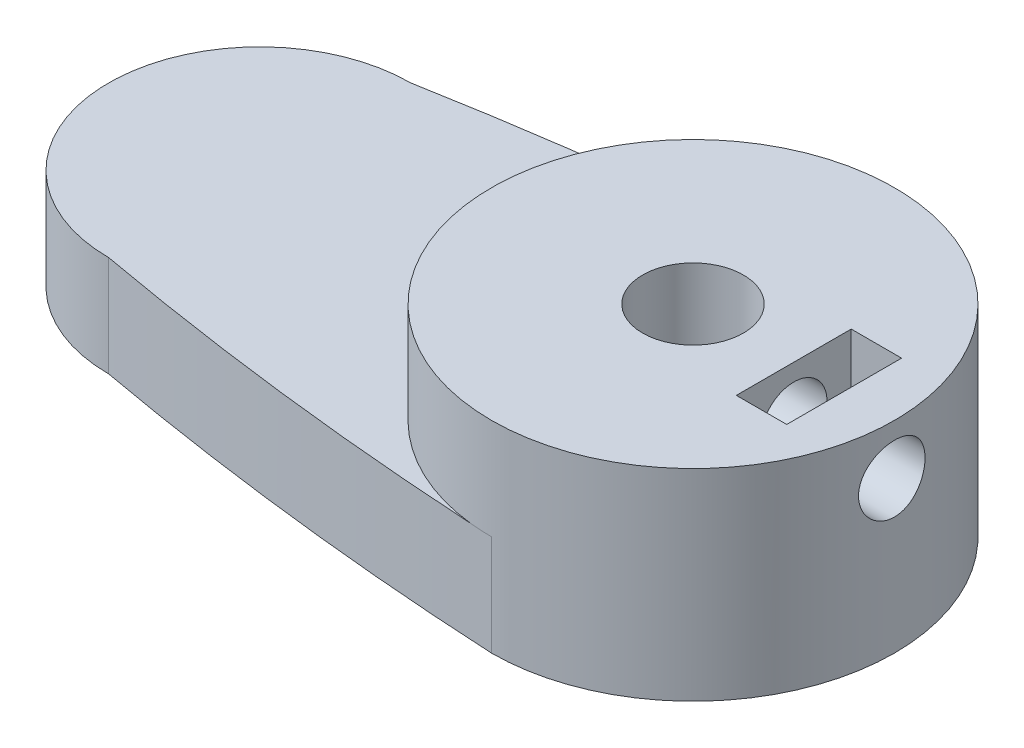
ISO-10303-21;
HEADER;
FILE_DESCRIPTION(('STEP AP214'),'2;1');
FILE_NAME('part.step','',(''),(''),'','','');
FILE_SCHEMA(('AUTOMOTIVE_DESIGN { 1 0 10303 214 1 1 1 1 }'));
ENDSEC;
DATA;
#1=APPLICATION_CONTEXT('core data for automotive mechanical design processes');
#2=APPLICATION_PROTOCOL_DEFINITION('international standard','automotive_design',2000,#1);
#3=PRODUCT_CONTEXT('',#1,'mechanical');
#4=PRODUCT('Part','Part','',(#3));
#5=PRODUCT_RELATED_PRODUCT_CATEGORY('part','',(#4));
#6=PRODUCT_DEFINITION_FORMATION('','',#4);
#7=PRODUCT_DEFINITION_CONTEXT('part definition',#1,'design');
#8=PRODUCT_DEFINITION('design','',#6,#7);
#9=PRODUCT_DEFINITION_SHAPE('','',#8);
#10=(LENGTH_UNIT() NAMED_UNIT(*) SI_UNIT(.MILLI.,.METRE.));
#11=(NAMED_UNIT(*) PLANE_ANGLE_UNIT() SI_UNIT($,.RADIAN.));
#12=(NAMED_UNIT(*) SI_UNIT($,.STERADIAN.) SOLID_ANGLE_UNIT());
#13=UNCERTAINTY_MEASURE_WITH_UNIT(LENGTH_MEASURE(1.E-05),#10,'distance_accuracy_value','');
#14=(GEOMETRIC_REPRESENTATION_CONTEXT(3) GLOBAL_UNCERTAINTY_ASSIGNED_CONTEXT((#13)) GLOBAL_UNIT_ASSIGNED_CONTEXT((#10,
#11,#12)) REPRESENTATION_CONTEXT('',''));
#15=CARTESIAN_POINT('',(0.,0.,0.));
#16=DIRECTION('',(0.,0.,1.));
#17=DIRECTION('',(1.,0.,0.));
#18=AXIS2_PLACEMENT_3D('',#15,#16,#17);
#19=CARTESIAN_POINT('',(0.,5.,0.));
#20=DIRECTION('',(0.,-1.,0.));
#21=DIRECTION('',(0.,0.,-1.));
#22=AXIS2_PLACEMENT_3D('',#19,#20,#21);
#23=CYLINDRICAL_SURFACE('',#22,9.99999999999969);
#24=CARTESIAN_POINT('',(0.,0.,0.));
#25=DIRECTION('',(0.,1.,0.));
#26=DIRECTION('',(0.,0.,1.));
#27=AXIS2_PLACEMENT_3D('',#24,#25,#26);
#28=CIRCLE('',#27,9.99999999999969);
#29=CARTESIAN_POINT('',(-6.46531439496556E-12,0.,9.99999999999969));
#30=VERTEX_POINT('',#29);
#31=CARTESIAN_POINT('',(-6.46574807583456E-12,0.,-9.99999999999969));
#32=VERTEX_POINT('',#31);
#33=EDGE_CURVE('E181',#30,#32,#28,.T.);
#34=ORIENTED_EDGE('',*,*,#33,.T.);
#35=DIRECTION('',(0.,-1.,0.));
#36=VECTOR('',#35,1.);
#37=CARTESIAN_POINT('',(-6.46574807583456E-12,5.,-9.99999999999969));
#38=LINE('',#37,#36);
#39=CARTESIAN_POINT('',(-6.46574807583456E-12,5.,-9.99999999999969));
#40=VERTEX_POINT('',#39);
#41=EDGE_CURVE('E187',#40,#32,#38,.T.);
#42=ORIENTED_EDGE('',*,*,#41,.F.);
#43=CARTESIAN_POINT('',(0.,5.,0.));
#44=DIRECTION('',(0.,1.,0.));
#45=DIRECTION('',(0.,0.,1.));
#46=AXIS2_PLACEMENT_3D('',#43,#44,#45);
#47=CIRCLE('',#46,9.99999999999969);
#48=CARTESIAN_POINT('',(-1.08613173197033,5.,-9.94084090310277));
#49=VERTEX_POINT('',#48);
#50=EDGE_CURVE('E48',#40,#49,#47,.T.);
#51=ORIENTED_EDGE('',*,*,#50,.T.);
#52=CARTESIAN_POINT('',(-1.08613173197033,5.,9.94084090310277));
#53=VERTEX_POINT('',#52);
#54=EDGE_CURVE('E11',#49,#53,#47,.T.);
#55=ORIENTED_EDGE('',*,*,#54,.T.);
#56=CARTESIAN_POINT('',(-6.46531439496556E-12,5.,9.99999999999969));
#57=VERTEX_POINT('',#56);
#58=EDGE_CURVE('E47',#53,#57,#47,.T.);
#59=ORIENTED_EDGE('',*,*,#58,.T.);
#60=DIRECTION('',(0.,-1.,0.));
#61=VECTOR('',#60,1.);
#62=CARTESIAN_POINT('',(-6.46531439496556E-12,5.,9.99999999999969));
#63=LINE('',#62,#61);
#64=EDGE_CURVE('E189',#57,#30,#63,.T.);
#65=ORIENTED_EDGE('',*,*,#64,.T.);
#66=EDGE_LOOP('',(#34,#42,#51,#55,#59,#65));
#67=FACE_BOUND('',#66,.T.);
#68=CARTESIAN_POINT('',(0.,10.,0.));
#69=DIRECTION('',(0.,1.,0.));
#70=DIRECTION('',(0.,0.,1.));
#71=AXIS2_PLACEMENT_3D('',#68,#69,#70);
#72=CIRCLE('',#71,9.99999999999969);
#73=CARTESIAN_POINT('',(0.,10.,9.99999999999969));
#74=VERTEX_POINT('',#73);
#75=EDGE_CURVE('E158',#74,#74,#72,.T.);
#76=ORIENTED_EDGE('',*,*,#75,.F.);
#77=EDGE_LOOP('',(#76));
#78=FACE_BOUND('',#77,.T.);
#79=CARTESIAN_POINT('',(9.86293566845054,7.5,1.65));
#80=CARTESIAN_POINT('',(9.86293731785527,7.40799815763411,1.64999629098035));
#81=CARTESIAN_POINT('',(9.86423691212901,7.31594574295345,1.64227909123111));
#82=CARTESIAN_POINT('',(9.86929026153193,7.13442278665812,1.61162706431046));
#83=CARTESIAN_POINT('',(9.87304629349879,7.04495472085215,1.58867811875357));
#84=CARTESIAN_POINT('',(9.8825757903559,6.87125382338446,1.52827489499291));
#85=CARTESIAN_POINT('',(9.88834758324568,6.78701672082335,1.49083263568619));
#86=CARTESIAN_POINT('',(9.90125628915023,6.62602977552741,1.40253539774319));
#87=CARTESIAN_POINT('',(9.90839304494616,6.54927907203176,1.3516819635744));
#88=CARTESIAN_POINT('',(9.92330460813646,6.40469249754825,1.23748166219591));
#89=CARTESIAN_POINT('',(9.9310843998024,6.33693946492918,1.17403055174128));
#90=CARTESIAN_POINT('',(9.94636114892715,6.21299083427328,1.03666129953611));
#91=CARTESIAN_POINT('',(9.9538580897316,6.15679591591812,0.962742542660854));
#92=CARTESIAN_POINT('',(9.96777711815898,6.05724831658915,0.806000158090804));
#93=CARTESIAN_POINT('',(9.97419266457545,6.01397264811038,0.723126989054621));
#94=CARTESIAN_POINT('',(9.98517060701266,5.94198691122183,0.551164106325252));
#95=CARTESIAN_POINT('',(9.98973312115035,5.91327591439407,0.462074789289345));
#96=CARTESIAN_POINT('',(9.99645574381574,5.87148765336425,0.28106409311301));
#97=CARTESIAN_POINT('',(9.99863722113444,5.85827125081373,0.1891756421165));
#98=CARTESIAN_POINT('',(10.0004253754506,5.84741474747605,0.00446128175041869));
#99=CARTESIAN_POINT('',(10.0000322241299,5.84977360809646,-0.0883645646994442));
#100=CARTESIAN_POINT('',(9.99673235089039,5.86989202770408,-0.27136761803782));
#101=CARTESIAN_POINT('',(9.99385006818927,5.88750185181637,-0.361561789664354));
#102=CARTESIAN_POINT('',(9.98592303427186,5.93738661870974,-0.537697224998586));
#103=CARTESIAN_POINT('',(9.98087821822551,5.96966200114778,-0.6236383611194));
#104=CARTESIAN_POINT('',(9.96915130593351,6.04811098155924,-0.789274301179365));
#105=CARTESIAN_POINT('',(9.96246194992901,6.09434641796588,-0.868939282087194));
#106=CARTESIAN_POINT('',(9.9481893971328,6.19935776294151,-1.01943645906903));
#107=CARTESIAN_POINT('',(9.94060612942516,6.25813466675174,-1.09026795344527));
#108=CARTESIAN_POINT('',(9.9252829108148,6.38739135719332,-1.22197197095425));
#109=CARTESIAN_POINT('',(9.91754216905049,6.45800199873007,-1.28271604906533));
#110=CARTESIAN_POINT('',(9.90286372793586,6.60848050325953,-1.3915146973154));
#111=CARTESIAN_POINT('',(9.8959260357106,6.68834844837508,-1.43956915487058));
#112=CARTESIAN_POINT('',(9.883638864771,6.85522179378199,-1.52164889999091));
#113=CARTESIAN_POINT('',(9.87829111185125,6.94223481993177,-1.55565895856361));
#114=CARTESIAN_POINT('',(9.86981807463738,7.12084660028683,-1.60854450758027));
#115=CARTESIAN_POINT('',(9.86669259878959,7.21244495852144,-1.62742130248435));
#116=CARTESIAN_POINT('',(9.86305497953614,7.39647869507773,-1.64932410589818));
#117=CARTESIAN_POINT('',(9.86251266770366,7.48889171756022,-1.6525331076067));
#118=CARTESIAN_POINT('',(9.86402245062627,7.672934586635,-1.64349666278561));
#119=CARTESIAN_POINT('',(9.86607444725262,7.76456446271754,-1.63125180079262));
#120=CARTESIAN_POINT('',(9.8725137823484,7.94386021319912,-1.59181115051362));
#121=CARTESIAN_POINT('',(9.8768865983285,8.03154709960179,-1.56470830150066));
#122=CARTESIAN_POINT('',(9.88746270071847,8.20113420759304,-1.49641841835946));
#123=CARTESIAN_POINT('',(9.89366609466424,8.28303408887803,-1.45523055679537));
#124=CARTESIAN_POINT('',(9.90727458613165,8.43953738917548,-1.35950711966145));
#125=CARTESIAN_POINT('',(9.9146900482085,8.51406808987048,-1.3048541529275));
#126=CARTESIAN_POINT('',(9.92985673064682,8.65296602506892,-1.183913241756));
#127=CARTESIAN_POINT('',(9.93760797410846,8.71733255890625,-1.11762449587139));
#128=CARTESIAN_POINT('',(9.95266815579972,8.83474209808013,-0.974483484791729));
#129=CARTESIAN_POINT('',(9.95997178743266,8.88766314576579,-0.897530542660932));
#130=CARTESIAN_POINT('',(9.97322896699209,8.97982570565766,-0.735720107735907));
#131=CARTESIAN_POINT('',(9.97918255791241,9.01906765351442,-0.650862866786068));
#132=CARTESIAN_POINT('',(9.98904576356796,9.08256776434511,-0.476016852877795));
#133=CARTESIAN_POINT('',(9.99296411355022,9.10689004529765,-0.386051879990883));
#134=CARTESIAN_POINT('',(9.99835224840565,9.14006697360012,-0.203244410238661));
#135=CARTESIAN_POINT('',(9.99982223057166,9.14892286725558,-0.110402145843639));
#136=CARTESIAN_POINT('',(10.0001452988377,9.15088033932715,0.0743467418035946));
#137=CARTESIAN_POINT('',(9.99902922611916,9.14416758785562,0.166251396930956));
#138=CARTESIAN_POINT('',(9.99436846725437,9.11557953808797,0.347605270735727));
#139=CARTESIAN_POINT('',(9.99082379405237,9.09370432060643,0.43705450249768));
#140=CARTESIAN_POINT('',(9.98170266675367,9.03548299259324,0.610889563964932));
#141=CARTESIAN_POINT('',(9.97612838706557,8.99915236494125,0.69528070036739));
#142=CARTESIAN_POINT('',(9.96355694814383,8.91307208786864,0.856798143174385));
#143=CARTESIAN_POINT('',(9.9565597236389,8.8633218228474,0.933924116084172));
#144=CARTESIAN_POINT('',(9.94181931422698,8.75115490006128,1.07965789685337));
#145=CARTESIAN_POINT('',(9.93406862876208,8.68860215785098,1.14816021705336));
#146=CARTESIAN_POINT('',(9.91874715128084,8.55289162780784,1.27376166628459));
#147=CARTESIAN_POINT('',(9.91117640182621,8.47973135938494,1.33085812058581));
#148=CARTESIAN_POINT('',(9.89701545481159,8.32428217423067,1.43238917357863));
#149=CARTESIAN_POINT('',(9.8904324019861,8.24193361471933,1.47673345800304));
#150=CARTESIAN_POINT('',(9.87907656402538,8.07088196298603,1.55089189624868));
#151=CARTESIAN_POINT('',(9.87430196413314,7.98218534781589,1.58072062483372));
#152=CARTESIAN_POINT('',(9.86816715424824,7.82761470046375,1.61849251524499));
#153=CARTESIAN_POINT('',(9.8662162021477,7.76267863497413,1.63028895802673));
#154=CARTESIAN_POINT('',(9.86359987952944,7.63183702563077,1.64604396057966));
#155=CARTESIAN_POINT('',(9.8629344864337,7.56593149882397,1.65000265800356));
#156=CARTESIAN_POINT('',(9.86293566845054,7.5,1.65));
#157=B_SPLINE_CURVE_WITH_KNOTS('',3,(#79,#80,#81,#82,#83,#84,#85,#86,#87,#88,#89,#90,#91,#92,
#93,#94,#95,#96,#97,#98,#99,#100,#101,#102,#103,#104,#105,#106,#107,#108,#109,#110,#111,#112,
#113,#114,#115,#116,#117,#118,#119,#120,#121,#122,#123,#124,#125,#126,#127,#128,#129,#130,#131,
#132,#133,#134,#135,#136,#137,#138,#139,#140,#141,#142,#143,#144,#145,#146,#147,#148,#149,#150,
#151,#152,#153,#154,#155,#156),.UNSPECIFIED.,.T.,.F.,(4,2,2,2,2,2,2,2,2,2,2,2,2,2,2,2,2,2,2,2,2,
2,2,2,2,2,2,2,2,2,2,2,2,2,2,2,2,2,4),(0.,0.275764439202393,0.551784843546747,0.827576840629572,
1.10333709061228,1.38148219258883,1.65964364637686,1.9394315673533,2.2192016511418,
2.49643973106728,2.77365932434104,3.0481876234325,3.32272415311684,3.59849508924515,
3.87428791760822,4.15336037881898,4.4324353159104,4.71181207725748,4.99116475423999,
5.26724677423094,5.54331835183578,5.81768243813566,6.09206264495277,6.36892529029641,
6.64580701282282,6.92550769092015,7.20519946032494,7.48368066222358,7.76213942263838,
8.03729441534009,8.31244794150179,8.58730754656388,8.8621797624382,9.14014153059558,
9.41816840579303,9.69811840194762,9.97778672322852,10.175411919191,10.3730336442719),.UNSPECIFIED.);
#158=CARTESIAN_POINT('',(9.86293566845054,7.5,1.65));
#159=VERTEX_POINT('',#158);
#160=EDGE_CURVE('E136',#159,#159,#157,.T.);
#161=ORIENTED_EDGE('',*,*,#160,.F.);
#162=EDGE_LOOP('',(#161));
#163=FACE_BOUND('',#162,.T.);
#164=ADVANCED_FACE('F35',(#67,#78,#163),#23,.T.);
#165=CARTESIAN_POINT('',(0.,5.,0.));
#166=DIRECTION('',(0.,-1.,0.));
#167=DIRECTION('',(0.,0.,-1.));
#168=AXIS2_PLACEMENT_3D('',#165,#166,#167);
#169=CYLINDRICAL_SURFACE('',#168,2.5);
#170=CARTESIAN_POINT('',(0.,10.,0.));
#171=DIRECTION('',(0.,1.,0.));
#172=DIRECTION('',(0.,0.,1.));
#173=AXIS2_PLACEMENT_3D('',#170,#171,#172);
#174=CIRCLE('',#173,2.5);
#175=CARTESIAN_POINT('',(0.,10.,2.5));
#176=VERTEX_POINT('',#175);
#177=EDGE_CURVE('E152',#176,#176,#174,.T.);
#178=ORIENTED_EDGE('',*,*,#177,.T.);
#179=EDGE_LOOP('',(#178));
#180=FACE_BOUND('',#179,.T.);
#181=CARTESIAN_POINT('',(0.,0.,0.));
#182=DIRECTION('',(0.,1.,0.));
#183=DIRECTION('',(0.,0.,1.));
#184=AXIS2_PLACEMENT_3D('',#181,#182,#183);
#185=CIRCLE('',#184,2.5);
#186=CARTESIAN_POINT('',(0.,0.,2.5));
#187=VERTEX_POINT('',#186);
#188=EDGE_CURVE('E160',#187,#187,#185,.T.);
#189=ORIENTED_EDGE('',*,*,#188,.F.);
#190=EDGE_LOOP('',(#189));
#191=FACE_BOUND('',#190,.T.);
#192=CARTESIAN_POINT('',(1.8781639970993,7.5,1.65));
#193=CARTESIAN_POINT('',(1.87817356740867,7.41920572344025,1.64999443072166));
#194=CARTESIAN_POINT('',(1.88347418282792,7.33837363094421,1.64401449371115));
#195=CARTESIAN_POINT('',(1.90365752241832,7.17958204939468,1.62058860250622));
#196=CARTESIAN_POINT('',(1.9185574504896,7.10162798408407,1.60312206083479));
#197=CARTESIAN_POINT('',(1.95530612756548,6.95136666841776,1.5580772753857));
#198=CARTESIAN_POINT('',(1.97708883218856,6.87901356849474,1.53059477126484));
#199=CARTESIAN_POINT('',(2.02503214275444,6.74005475261922,1.46657517741326));
#200=CARTESIAN_POINT('',(2.05119370638085,6.67345029877151,1.43003610611276));
#201=CARTESIAN_POINT('',(2.10971828562918,6.53678263312318,1.342483593019));
#202=CARTESIAN_POINT('',(2.14241946389367,6.46773272348993,1.29011420470095));
#203=CARTESIAN_POINT('',(2.20758221587981,6.33852285385609,1.17514144468482));
#204=CARTESIAN_POINT('',(2.24004353252863,6.27837139970331,1.11252840012499));
#205=CARTESIAN_POINT('',(2.3064419767716,6.16026728380111,0.968234915676895));
#206=CARTESIAN_POINT('',(2.33994640603816,6.10380909636231,0.885111648041919));
#207=CARTESIAN_POINT('',(2.39949293751456,6.00615884571344,0.707908997031474));
#208=CARTESIAN_POINT('',(2.42554320107045,5.96495007175718,0.613841755901939));
#209=CARTESIAN_POINT('',(2.46464353514927,5.90392638773328,0.428365536633283));
#210=CARTESIAN_POINT('',(2.47881191391302,5.88225085051056,0.337811072451688));
#211=CARTESIAN_POINT('',(2.49700266516609,5.85450985288345,0.15338070492646));
#212=CARTESIAN_POINT('',(2.50103745363967,5.84842528975625,0.0595090091735691));
#213=CARTESIAN_POINT('',(2.49868729659539,5.85199137537904,-0.113712663637903));
#214=CARTESIAN_POINT('',(2.49376656842582,5.85943066791314,-0.19314050029094));
#215=CARTESIAN_POINT('',(2.47671798966374,5.88546307542177,-0.349338308191109));
#216=CARTESIAN_POINT('',(2.46458960851095,5.90405701149819,-0.426108083336223));
#217=CARTESIAN_POINT('',(2.4341916732427,5.95141471587266,-0.574862419576157));
#218=CARTESIAN_POINT('',(2.41593946394568,5.98014977277161,-0.646859815580458));
#219=CARTESIAN_POINT('',(2.37464804586783,6.04668210407176,-0.785017034503292));
#220=CARTESIAN_POINT('',(2.35160793342517,6.0844810893931,-0.851175752075163));
#221=CARTESIAN_POINT('',(2.29902245001356,6.1735518083649,-0.985047000791316));
#222=CARTESIAN_POINT('',(2.26902056419845,6.22593769862121,-1.05183695764556));
#223=CARTESIAN_POINT('',(2.20709218917539,6.33980977224161,-1.17625968695308));
#224=CARTESIAN_POINT('',(2.17516278943164,6.40130993266576,-1.23387810796582));
#225=CARTESIAN_POINT('',(2.10711048312634,6.54249309742574,-1.34724934289722));
#226=CARTESIAN_POINT('',(2.07108428413495,6.62351930242508,-1.40139996434748));
#227=CARTESIAN_POINT('',(2.00437957659369,6.79552977716466,-1.49525229324493));
#228=CARTESIAN_POINT('',(1.97369192533599,6.8864965788585,-1.53497883258692));
#229=CARTESIAN_POINT('',(1.93021206234818,7.04995098820038,-1.58906609884218));
#230=CARTESIAN_POINT('',(1.91481376393406,7.12041693805926,-1.60742065844978));
#231=CARTESIAN_POINT('',(1.89156962487725,7.26431516175901,-1.63471528383589));
#232=CARTESIAN_POINT('',(1.88371114114999,7.33774225396906,-1.64367111218459));
#233=CARTESIAN_POINT('',(1.87675635499969,7.48586101896471,-1.65161100823905));
#234=CARTESIAN_POINT('',(1.87769482426887,7.56055654417967,-1.65055550398268));
#235=CARTESIAN_POINT('',(1.88825914723376,7.70853329214711,-1.63845508785892));
#236=CARTESIAN_POINT('',(1.89789215655035,7.78181329917786,-1.62740194790477));
#237=CARTESIAN_POINT('',(1.9237732078827,7.92184393005247,-1.59670654181039));
#238=CARTESIAN_POINT('',(1.93971829428859,7.98873984330189,-1.57745493961549));
#239=CARTESIAN_POINT('',(1.97637475195714,8.11841178969353,-1.53127715983159));
#240=CARTESIAN_POINT('',(1.99708770330353,8.18118644815702,-1.5043484373163));
#241=CARTESIAN_POINT('',(2.04592024038529,8.31415346628877,-1.43744371796297));
#242=CARTESIAN_POINT('',(2.07469338349939,8.38333372238217,-1.39593741519332));
#243=CARTESIAN_POINT('',(2.13386307226144,8.5145459964164,-1.30370192953134));
#244=CARTESIAN_POINT('',(2.16426156090021,8.57656916573016,-1.25296152557762));
#245=CARTESIAN_POINT('',(2.23066104299161,8.70497720690553,-1.13132559349668));
#246=CARTESIAN_POINT('',(2.26650752858328,8.76957174430522,-1.05843368437052));
#247=CARTESIAN_POINT('',(2.33354741548986,8.88570705515826,-0.901029136145253));
#248=CARTESIAN_POINT('',(2.36474520160667,8.93726016214953,-0.816527594120818));
#249=CARTESIAN_POINT('',(2.41383928477657,9.01653703803176,-0.655022436944629));
#250=CARTESIAN_POINT('',(2.43314294605933,9.04694679383522,-0.579766982761509));
#251=CARTESIAN_POINT('',(2.46500344203446,9.09659229995709,-0.42430571779811));
#252=CARTESIAN_POINT('',(2.47756592552063,9.11583740683283,-0.344104114697728));
#253=CARTESIAN_POINT('',(2.49483359194805,9.14219220812135,-0.180532057501485));
#254=CARTESIAN_POINT('',(2.49950622522129,9.14925163301676,-0.0971499203468173));
#255=CARTESIAN_POINT('',(2.50041880991432,9.15063478274176,0.0697703046886295));
#256=CARTESIAN_POINT('',(2.49665914509096,9.14495908715117,0.153308385299487));
#257=CARTESIAN_POINT('',(2.48162224491364,9.1220405182467,0.312248842068652));
#258=CARTESIAN_POINT('',(2.47086791156197,9.10560173202656,0.387820405838222));
#259=CARTESIAN_POINT('',(2.44325497490618,9.06277383647505,0.534890956581187));
#260=CARTESIAN_POINT('',(2.42639541232541,9.0363831634387,0.606389301510777));
#261=CARTESIAN_POINT('',(2.38659098522815,8.97274303281136,0.748299731069987));
#262=CARTESIAN_POINT('',(2.36333062488107,8.93491604681923,0.818362050887246));
#263=CARTESIAN_POINT('',(2.31298664760704,8.85039241585808,0.95139973492027));
#264=CARTESIAN_POINT('',(2.2859005630314,8.80369003936037,1.01437047747239));
#265=CARTESIAN_POINT('',(2.2252813274897,8.69447092484744,1.14186276834817));
#266=CARTESIAN_POINT('',(2.19140310364952,8.63062279825256,1.20508031729176));
#267=CARTESIAN_POINT('',(2.12387294022856,8.49343165955849,1.32046767601712));
#268=CARTESIAN_POINT('',(2.09022116132146,8.42008252799857,1.37263030790414));
#269=CARTESIAN_POINT('',(2.02963185186415,8.27202679801739,1.46053735742482));
#270=CARTESIAN_POINT('',(2.00236030827309,8.19810504223545,1.49736813204504));
#271=CARTESIAN_POINT('',(1.95397052678842,8.04389086711673,1.55999123252304));
#272=CARTESIAN_POINT('',(1.93283919103844,7.96361248010693,1.58580711054236));
#273=CARTESIAN_POINT('',(1.90415675714692,7.81930860318632,1.62004735146957));
#274=CARTESIAN_POINT('',(1.89451740482451,7.75635309239306,1.63122690692697));
#275=CARTESIAN_POINT('',(1.88151889606352,7.62893919817754,1.64620346660995));
#276=CARTESIAN_POINT('',(1.8781563590673,7.56448164267576,1.65000444482246));
#277=CARTESIAN_POINT('',(1.8781639970993,7.5,1.65));
#278=B_SPLINE_CURVE_WITH_KNOTS('',3,(#192,#193,#194,#195,#196,#197,#198,#199,#200,#201,#202,
#203,#204,#205,#206,#207,#208,#209,#210,#211,#212,#213,#214,#215,#216,#217,#218,#219,#220,#221,
#222,#223,#224,#225,#226,#227,#228,#229,#230,#231,#232,#233,#234,#235,#236,#237,#238,#239,#240,
#241,#242,#243,#244,#245,#246,#247,#248,#249,#250,#251,#252,#253,#254,#255,#256,#257,#258,#259,
#260,#261,#262,#263,#264,#265,#266,#267,#268,#269,#270,#271,#272,#273,#274,#275,#276,#277),
.UNSPECIFIED.,.T.,.F.,(4,2,2,2,2,2,2,2,2,2,2,2,2,2,2,2,2,2,2,2,2,2,2,2,2,2,2,2,2,2,2,2,2,2,2,2,
2,2,2,2,2,2,4),(0.,0.242089089232209,0.484613262365226,0.72487754222912,0.965194438206266,
1.24204242334406,1.51915335508711,1.83517136959405,2.15084204970881,2.43163690958527,
2.71208756281943,2.9507129324479,3.18935586962918,3.4273285139579,3.66534611375404,
3.93440451568685,4.20387988176701,4.51414003592555,4.82386349786491,5.0462567712386,
5.26827647088755,5.49117411610793,5.71425537389903,5.92772322794786,6.14126192794926,
6.39732261532283,6.65369656488884,6.96356575078112,7.27314078239638,7.52238413686411,
7.77141830954323,8.02147738775787,8.27152508592675,8.50474641601319,8.73800440662637,
8.98590102363147,9.23395827408611,9.52089661145364,9.80802068929723,10.067982581361,
10.3273858003361,10.520700440269,10.7139109350251),.UNSPECIFIED.);
#279=CARTESIAN_POINT('',(1.8781639970993,7.5,1.65));
#280=VERTEX_POINT('',#279);
#281=EDGE_CURVE('E355',#280,#280,#278,.T.);
#282=ORIENTED_EDGE('',*,*,#281,.T.);
#283=EDGE_LOOP('',(#282));
#284=FACE_BOUND('',#283,.T.);
#285=ADVANCED_FACE('F37',(#180,#191,#284),#169,.F.);
#286=CARTESIAN_POINT('',(-21.5,5.,0.));
#287=DIRECTION('',(0.,-1.,0.));
#288=DIRECTION('',(0.,0.,-1.));
#289=AXIS2_PLACEMENT_3D('',#286,#287,#288);
#290=CYLINDRICAL_SURFACE('',#289,7.5);
#291=CARTESIAN_POINT('',(-21.5,0.,0.));
#292=DIRECTION('',(0.,1.,0.));
#293=DIRECTION('',(0.,0.,1.));
#294=AXIS2_PLACEMENT_3D('',#291,#292,#293);
#295=CIRCLE('',#294,7.5);
#296=CARTESIAN_POINT('',(-21.5,0.,-7.49999999999999));
#297=VERTEX_POINT('',#296);
#298=CARTESIAN_POINT('',(-21.5,0.,7.5));
#299=VERTEX_POINT('',#298);
#300=EDGE_CURVE('E176',#297,#299,#295,.T.);
#301=ORIENTED_EDGE('',*,*,#300,.T.);
#302=DIRECTION('',(0.,-1.,0.));
#303=VECTOR('',#302,1.);
#304=CARTESIAN_POINT('',(-21.5,5.,7.5));
#305=LINE('',#304,#303);
#306=CARTESIAN_POINT('',(-21.5,5.,7.5));
#307=VERTEX_POINT('',#306);
#308=EDGE_CURVE('E45',#307,#299,#305,.T.);
#309=ORIENTED_EDGE('',*,*,#308,.F.);
#310=CARTESIAN_POINT('',(-21.5,5.,0.));
#311=DIRECTION('',(0.,1.,0.));
#312=DIRECTION('',(0.,0.,1.));
#313=AXIS2_PLACEMENT_3D('',#310,#311,#312);
#314=CIRCLE('',#313,7.5);
#315=CARTESIAN_POINT('',(-21.5,5.,-7.49999999999999));
#316=VERTEX_POINT('',#315);
#317=EDGE_CURVE('E163',#316,#307,#314,.T.);
#318=ORIENTED_EDGE('',*,*,#317,.F.);
#319=DIRECTION('',(0.,-1.,0.));
#320=VECTOR('',#319,1.);
#321=CARTESIAN_POINT('',(-21.5,5.,-7.49999999999999));
#322=LINE('',#321,#320);
#323=EDGE_CURVE('E173',#316,#297,#322,.T.);
#324=ORIENTED_EDGE('',*,*,#323,.T.);
#325=EDGE_LOOP('',(#301,#309,#318,#324));
#326=FACE_BOUND('',#325,.T.);
#327=ADVANCED_FACE('F199',(#326),#290,.T.);
#328=CARTESIAN_POINT('',(8.57625468504118,5.,-157.455790291354));
#329=DIRECTION('',(0.,-1.,0.));
#330=DIRECTION('',(0.,0.,-1.));
#331=AXIS2_PLACEMENT_3D('',#328,#329,#330);
#332=CYLINDRICAL_SURFACE('',#331,167.675263072776);
#333=CARTESIAN_POINT('',(8.57625468504118,0.,-157.455790291354));
#334=DIRECTION('',(0.,1.,0.));
#335=DIRECTION('',(0.,0.,1.));
#336=AXIS2_PLACEMENT_3D('',#333,#334,#335);
#337=CIRCLE('',#336,167.675263072776);
#338=EDGE_CURVE('E179',#299,#30,#337,.T.);
#339=ORIENTED_EDGE('',*,*,#338,.T.);
#340=ORIENTED_EDGE('',*,*,#64,.F.);
#341=CARTESIAN_POINT('',(8.57625468504118,5.,-157.455790291354));
#342=DIRECTION('',(0.,1.,0.));
#343=DIRECTION('',(0.,0.,1.));
#344=AXIS2_PLACEMENT_3D('',#341,#342,#343);
#345=CIRCLE('',#344,167.675263072776);
#346=EDGE_CURVE('E166',#53,#57,#345,.T.);
#347=ORIENTED_EDGE('',*,*,#346,.F.);
#348=EDGE_CURVE('E168',#307,#53,#345,.T.);
#349=ORIENTED_EDGE('',*,*,#348,.F.);
#350=ORIENTED_EDGE('',*,*,#308,.T.);
#351=EDGE_LOOP('',(#339,#340,#347,#349,#350));
#352=FACE_BOUND('',#351,.T.);
#353=ADVANCED_FACE('F194',(#352),#332,.T.);
#354=CARTESIAN_POINT('',(8.57625468504119,5.,157.455790291354));
#355=DIRECTION('',(0.,-1.,0.));
#356=DIRECTION('',(0.,0.,-1.));
#357=AXIS2_PLACEMENT_3D('',#354,#355,#356);
#358=CYLINDRICAL_SURFACE('',#357,167.675263072776);
#359=CARTESIAN_POINT('',(8.57625468504119,0.,157.455790291354));
#360=DIRECTION('',(0.,1.,0.));
#361=DIRECTION('',(0.,0.,1.));
#362=AXIS2_PLACEMENT_3D('',#359,#360,#361);
#363=CIRCLE('',#362,167.675263072776);
#364=EDGE_CURVE('E167',#297,#32,#363,.F.);
#365=ORIENTED_EDGE('',*,*,#364,.F.);
#366=ORIENTED_EDGE('',*,*,#323,.F.);
#367=CARTESIAN_POINT('',(8.57625468504119,5.,157.455790291354));
#368=DIRECTION('',(0.,1.,0.));
#369=DIRECTION('',(0.,0.,1.));
#370=AXIS2_PLACEMENT_3D('',#367,#368,#369);
#371=CIRCLE('',#370,167.675263072776);
#372=EDGE_CURVE('E171',#316,#49,#371,.F.);
#373=ORIENTED_EDGE('',*,*,#372,.T.);
#374=EDGE_CURVE('E170',#49,#40,#371,.F.);
#375=ORIENTED_EDGE('',*,*,#374,.T.);
#376=ORIENTED_EDGE('',*,*,#41,.T.);
#377=EDGE_LOOP('',(#365,#366,#373,#375,#376));
#378=FACE_BOUND('',#377,.T.);
#379=ADVANCED_FACE('F205',(#378),#358,.T.);
#380=CARTESIAN_POINT('',(0.,5.,0.));
#381=DIRECTION('',(0.,1.,0.));
#382=DIRECTION('',(0.,0.,1.));
#383=AXIS2_PLACEMENT_3D('',#380,#381,#382);
#384=PLANE('',#383);
#385=ORIENTED_EDGE('',*,*,#54,.F.);
#386=ORIENTED_EDGE('',*,*,#372,.F.);
#387=ORIENTED_EDGE('',*,*,#317,.T.);
#388=ORIENTED_EDGE('',*,*,#348,.T.);
#389=EDGE_LOOP('',(#385,#386,#387,#388));
#390=FACE_BOUND('',#389,.T.);
#391=ADVANCED_FACE('F258',(#390),#384,.T.);
#392=CARTESIAN_POINT('',(0.,0.,0.));
#393=DIRECTION('',(0.,1.,0.));
#394=DIRECTION('',(0.,0.,1.));
#395=AXIS2_PLACEMENT_3D('',#392,#393,#394);
#396=PLANE('',#395);
#397=ORIENTED_EDGE('',*,*,#188,.T.);
#398=EDGE_LOOP('',(#397));
#399=FACE_BOUND('',#398,.T.);
#400=ORIENTED_EDGE('',*,*,#300,.F.);
#401=ORIENTED_EDGE('',*,*,#364,.T.);
#402=ORIENTED_EDGE('',*,*,#33,.F.);
#403=ORIENTED_EDGE('',*,*,#338,.F.);
#404=EDGE_LOOP('',(#400,#401,#402,#403));
#405=FACE_BOUND('',#404,.T.);
#406=ADVANCED_FACE('F202',(#399,#405),#396,.F.);
#407=CARTESIAN_POINT('',(0.,5.,0.));
#408=DIRECTION('',(0.,1.,0.));
#409=DIRECTION('',(0.,0.,1.));
#410=AXIS2_PLACEMENT_3D('',#407,#408,#409);
#411=PLANE('',#410);
#412=ORIENTED_EDGE('',*,*,#58,.F.);
#413=ORIENTED_EDGE('',*,*,#346,.T.);
#414=EDGE_LOOP('',(#412,#413));
#415=FACE_BOUND('',#414,.T.);
#416=ADVANCED_FACE('F215',(#415),#411,.F.);
#417=CARTESIAN_POINT('',(0.,10.,0.));
#418=DIRECTION('',(0.,1.,0.));
#419=DIRECTION('',(0.,0.,1.));
#420=AXIS2_PLACEMENT_3D('',#417,#418,#419);
#421=PLANE('',#420);
#422=DIRECTION('',(0.,0.,-1.));
#423=VECTOR('',#422,1.);
#424=CARTESIAN_POINT('',(7.5,10.,2.85));
#425=LINE('',#424,#423);
#426=CARTESIAN_POINT('',(7.5,10.,2.85));
#427=VERTEX_POINT('',#426);
#428=CARTESIAN_POINT('',(7.5,10.,-2.85));
#429=VERTEX_POINT('',#428);
#430=EDGE_CURVE('E55',#427,#429,#425,.T.);
#431=ORIENTED_EDGE('',*,*,#430,.F.);
#432=DIRECTION('',(1.,0.,0.));
#433=VECTOR('',#432,1.);
#434=CARTESIAN_POINT('',(5.,10.,2.85));
#435=LINE('',#434,#433);
#436=CARTESIAN_POINT('',(5.,10.,2.85));
#437=VERTEX_POINT('',#436);
#438=EDGE_CURVE('E130',#437,#427,#435,.T.);
#439=ORIENTED_EDGE('',*,*,#438,.F.);
#440=DIRECTION('',(0.,0.,1.));
#441=VECTOR('',#440,1.);
#442=CARTESIAN_POINT('',(5.,10.,2.85));
#443=LINE('',#442,#441);
#444=CARTESIAN_POINT('',(5.,10.,-2.85));
#445=VERTEX_POINT('',#444);
#446=EDGE_CURVE('E133',#445,#437,#443,.T.);
#447=ORIENTED_EDGE('',*,*,#446,.F.);
#448=DIRECTION('',(-1.,0.,0.));
#449=VECTOR('',#448,1.);
#450=CARTESIAN_POINT('',(5.,10.,-2.85));
#451=LINE('',#450,#449);
#452=EDGE_CURVE('E146',#429,#445,#451,.T.);
#453=ORIENTED_EDGE('',*,*,#452,.F.);
#454=EDGE_LOOP('',(#431,#439,#447,#453));
#455=FACE_BOUND('',#454,.T.);
#456=ORIENTED_EDGE('',*,*,#75,.T.);
#457=EDGE_LOOP('',(#456));
#458=FACE_BOUND('',#457,.T.);
#459=ORIENTED_EDGE('',*,*,#177,.F.);
#460=EDGE_LOOP('',(#459));
#461=FACE_BOUND('',#460,.T.);
#462=ADVANCED_FACE('F219',(#455,#458,#461),#421,.T.);
#463=ORIENTED_EDGE('',*,*,#374,.F.);
#464=ORIENTED_EDGE('',*,*,#50,.F.);
#465=EDGE_LOOP('',(#463,#464));
#466=FACE_BOUND('',#465,.T.);
#467=ADVANCED_FACE('F217',(#466),#411,.F.);
#468=CARTESIAN_POINT('',(7.5,5.,2.85));
#469=DIRECTION('',(1.,0.,0.));
#470=DIRECTION('',(0.,0.,-1.));
#471=AXIS2_PLACEMENT_3D('',#468,#469,#470);
#472=PLANE('',#471);
#473=CARTESIAN_POINT('',(7.5,7.5,0.));
#474=DIRECTION('',(1.,0.,0.));
#475=DIRECTION('',(0.,0.,-1.));
#476=AXIS2_PLACEMENT_3D('',#473,#474,#475);
#477=CIRCLE('',#476,1.65);
#478=CARTESIAN_POINT('',(7.5,7.5,-1.65));
#479=VERTEX_POINT('',#478);
#480=EDGE_CURVE('E360',#479,#479,#477,.F.);
#481=ORIENTED_EDGE('',*,*,#480,.F.);
#482=EDGE_LOOP('',(#481));
#483=FACE_BOUND('',#482,.T.);
#484=ORIENTED_EDGE('',*,*,#430,.T.);
#485=DIRECTION('',(0.,1.,0.));
#486=VECTOR('',#485,1.);
#487=CARTESIAN_POINT('',(7.5,5.,-2.85));
#488=LINE('',#487,#486);
#489=CARTESIAN_POINT('',(7.5,5.,-2.85));
#490=VERTEX_POINT('',#489);
#491=EDGE_CURVE('E108',#490,#429,#488,.T.);
#492=ORIENTED_EDGE('',*,*,#491,.F.);
#493=DIRECTION('',(0.,0.,-1.));
#494=VECTOR('',#493,1.);
#495=CARTESIAN_POINT('',(7.5,5.,2.85));
#496=LINE('',#495,#494);
#497=CARTESIAN_POINT('',(7.5,5.,2.85));
#498=VERTEX_POINT('',#497);
#499=EDGE_CURVE('E112',#498,#490,#496,.T.);
#500=ORIENTED_EDGE('',*,*,#499,.F.);
#501=DIRECTION('',(0.,1.,0.));
#502=VECTOR('',#501,1.);
#503=CARTESIAN_POINT('',(7.5,5.,2.85));
#504=LINE('',#503,#502);
#505=EDGE_CURVE('E150',#498,#427,#504,.T.);
#506=ORIENTED_EDGE('',*,*,#505,.T.);
#507=EDGE_LOOP('',(#484,#492,#500,#506));
#508=FACE_BOUND('',#507,.T.);
#509=ADVANCED_FACE('F110',(#483,#508),#472,.F.);
#510=CARTESIAN_POINT('',(5.,5.,2.85));
#511=DIRECTION('',(0.,0.,1.));
#512=DIRECTION('',(1.,0.,0.));
#513=AXIS2_PLACEMENT_3D('',#510,#511,#512);
#514=PLANE('',#513);
#515=ORIENTED_EDGE('',*,*,#438,.T.);
#516=ORIENTED_EDGE('',*,*,#505,.F.);
#517=DIRECTION('',(1.,0.,0.));
#518=VECTOR('',#517,1.);
#519=CARTESIAN_POINT('',(5.,5.,2.85));
#520=LINE('',#519,#518);
#521=CARTESIAN_POINT('',(5.,5.,2.85));
#522=VERTEX_POINT('',#521);
#523=EDGE_CURVE('E118',#522,#498,#520,.T.);
#524=ORIENTED_EDGE('',*,*,#523,.F.);
#525=DIRECTION('',(0.,1.,0.));
#526=VECTOR('',#525,1.);
#527=CARTESIAN_POINT('',(5.,5.,2.85));
#528=LINE('',#527,#526);
#529=EDGE_CURVE('E153',#522,#437,#528,.T.);
#530=ORIENTED_EDGE('',*,*,#529,.T.);
#531=EDGE_LOOP('',(#515,#516,#524,#530));
#532=FACE_BOUND('',#531,.T.);
#533=ADVANCED_FACE('F225',(#532),#514,.F.);
#534=CARTESIAN_POINT('',(5.,5.,2.85));
#535=DIRECTION('',(-1.,0.,0.));
#536=DIRECTION('',(0.,0.,1.));
#537=AXIS2_PLACEMENT_3D('',#534,#535,#536);
#538=PLANE('',#537);
#539=CARTESIAN_POINT('',(5.,7.5,0.));
#540=DIRECTION('',(-1.,0.,0.));
#541=DIRECTION('',(0.,0.,1.));
#542=AXIS2_PLACEMENT_3D('',#539,#540,#541);
#543=CIRCLE('',#542,1.65);
#544=CARTESIAN_POINT('',(5.,7.5,1.65));
#545=VERTEX_POINT('',#544);
#546=EDGE_CURVE('E40',#545,#545,#543,.F.);
#547=ORIENTED_EDGE('',*,*,#546,.F.);
#548=EDGE_LOOP('',(#547));
#549=FACE_BOUND('',#548,.T.);
#550=ORIENTED_EDGE('',*,*,#446,.T.);
#551=ORIENTED_EDGE('',*,*,#529,.F.);
#552=DIRECTION('',(0.,0.,1.));
#553=VECTOR('',#552,1.);
#554=CARTESIAN_POINT('',(5.,5.,2.85));
#555=LINE('',#554,#553);
#556=CARTESIAN_POINT('',(5.,5.,-2.85));
#557=VERTEX_POINT('',#556);
#558=EDGE_CURVE('E126',#557,#522,#555,.T.);
#559=ORIENTED_EDGE('',*,*,#558,.F.);
#560=DIRECTION('',(0.,1.,0.));
#561=VECTOR('',#560,1.);
#562=CARTESIAN_POINT('',(5.,5.,-2.85));
#563=LINE('',#562,#561);
#564=EDGE_CURVE('E117',#557,#445,#563,.T.);
#565=ORIENTED_EDGE('',*,*,#564,.T.);
#566=EDGE_LOOP('',(#550,#551,#559,#565));
#567=FACE_BOUND('',#566,.T.);
#568=ADVANCED_FACE('F287',(#549,#567),#538,.F.);
#569=CARTESIAN_POINT('',(5.,5.,-2.85));
#570=DIRECTION('',(0.,0.,-1.));
#571=DIRECTION('',(-1.,0.,0.));
#572=AXIS2_PLACEMENT_3D('',#569,#570,#571);
#573=PLANE('',#572);
#574=ORIENTED_EDGE('',*,*,#452,.T.);
#575=ORIENTED_EDGE('',*,*,#564,.F.);
#576=DIRECTION('',(-1.,0.,0.));
#577=VECTOR('',#576,1.);
#578=CARTESIAN_POINT('',(5.,5.,-2.85));
#579=LINE('',#578,#577);
#580=EDGE_CURVE('E121',#490,#557,#579,.T.);
#581=ORIENTED_EDGE('',*,*,#580,.F.);
#582=ORIENTED_EDGE('',*,*,#491,.T.);
#583=EDGE_LOOP('',(#574,#575,#581,#582));
#584=FACE_BOUND('',#583,.T.);
#585=ADVANCED_FACE('F122',(#584),#573,.F.);
#586=CARTESIAN_POINT('',(0.,5.,0.));
#587=DIRECTION('',(0.,-1.,0.));
#588=DIRECTION('',(0.,0.,-1.));
#589=AXIS2_PLACEMENT_3D('',#586,#587,#588);
#590=PLANE('',#589);
#591=ORIENTED_EDGE('',*,*,#499,.T.);
#592=ORIENTED_EDGE('',*,*,#580,.T.);
#593=ORIENTED_EDGE('',*,*,#558,.T.);
#594=ORIENTED_EDGE('',*,*,#523,.T.);
#595=EDGE_LOOP('',(#591,#592,#593,#594));
#596=FACE_BOUND('',#595,.T.);
#597=ADVANCED_FACE('F128',(#596),#590,.F.);
#598=CARTESIAN_POINT('',(25.,7.5,0.));
#599=DIRECTION('',(-1.,0.,0.));
#600=DIRECTION('',(0.,0.,1.));
#601=AXIS2_PLACEMENT_3D('',#598,#599,#600);
#602=CYLINDRICAL_SURFACE('',#601,1.65);
#603=ORIENTED_EDGE('',*,*,#281,.F.);
#604=EDGE_LOOP('',(#603));
#605=FACE_BOUND('',#604,.T.);
#606=ORIENTED_EDGE('',*,*,#546,.T.);
#607=EDGE_LOOP('',(#606));
#608=FACE_BOUND('',#607,.T.);
#609=ADVANCED_FACE('F307',(#605,#608),#602,.F.);
#610=ORIENTED_EDGE('',*,*,#480,.T.);
#611=EDGE_LOOP('',(#610));
#612=FACE_BOUND('',#611,.T.);
#613=ORIENTED_EDGE('',*,*,#160,.T.);
#614=EDGE_LOOP('',(#613));
#615=FACE_BOUND('',#614,.T.);
#616=ADVANCED_FACE('F339',(#612,#615),#602,.F.);
#617=CLOSED_SHELL('',(#164,#285,#327,#353,#379,#391,#406,#416,#462,#467,#509,#533,#568,#585,
#597,#609,#616));
#618=MANIFOLD_SOLID_BREP('B2',#617);
#619=ADVANCED_BREP_SHAPE_REPRESENTATION('',(#18,#618),#14);
#620=SHAPE_DEFINITION_REPRESENTATION(#9,#619);
ENDSEC;
END-ISO-10303-21;
